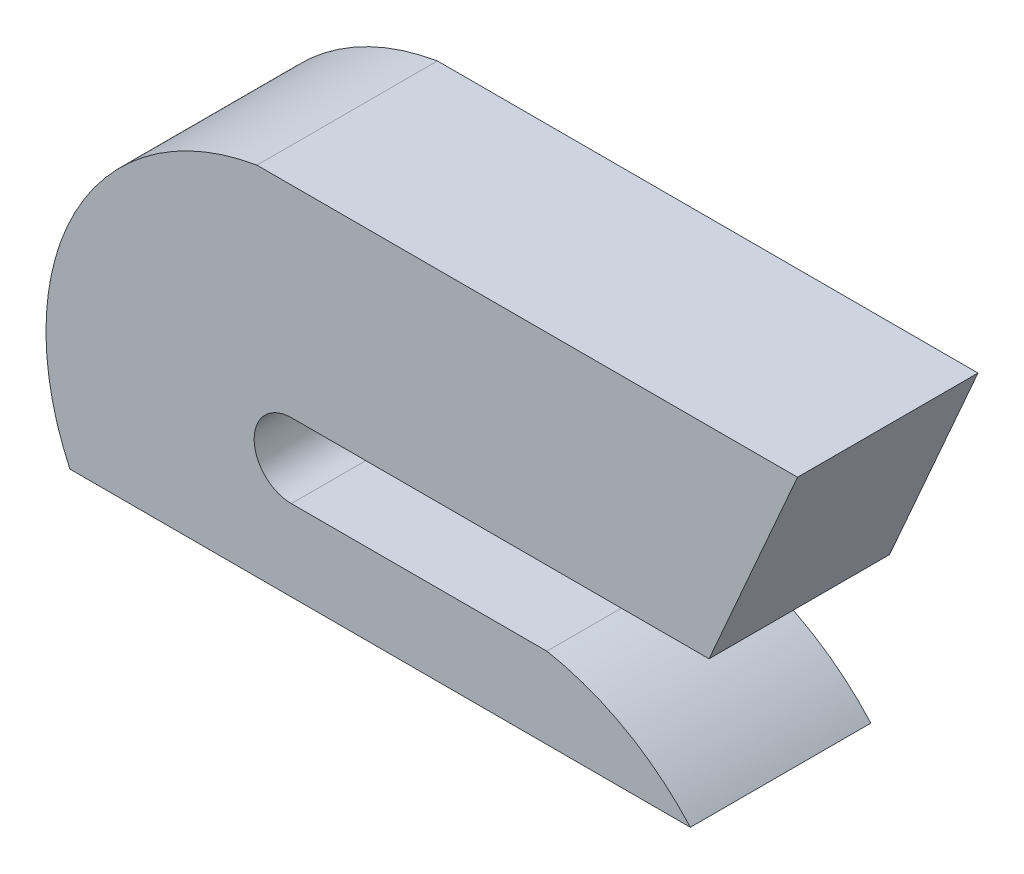
ISO-10303-21;
HEADER;
FILE_DESCRIPTION(('STEP AP214'),'2;1');
FILE_NAME('part.step','',(''),(''),'','','');
FILE_SCHEMA(('AUTOMOTIVE_DESIGN { 1 0 10303 214 1 1 1 1 }'));
ENDSEC;
DATA;
#1=APPLICATION_CONTEXT('core data for automotive mechanical design processes');
#2=APPLICATION_PROTOCOL_DEFINITION('international standard','automotive_design',2000,#1);
#3=PRODUCT_CONTEXT('',#1,'mechanical');
#4=PRODUCT('Part','Part','',(#3));
#5=PRODUCT_RELATED_PRODUCT_CATEGORY('part','',(#4));
#6=PRODUCT_DEFINITION_FORMATION('','',#4);
#7=PRODUCT_DEFINITION_CONTEXT('part definition',#1,'design');
#8=PRODUCT_DEFINITION('design','',#6,#7);
#9=PRODUCT_DEFINITION_SHAPE('','',#8);
#10=(LENGTH_UNIT() NAMED_UNIT(*) SI_UNIT(.MILLI.,.METRE.));
#11=(NAMED_UNIT(*) PLANE_ANGLE_UNIT() SI_UNIT($,.RADIAN.));
#12=(NAMED_UNIT(*) SI_UNIT($,.STERADIAN.) SOLID_ANGLE_UNIT());
#13=UNCERTAINTY_MEASURE_WITH_UNIT(LENGTH_MEASURE(1.E-05),#10,'distance_accuracy_value','');
#14=(GEOMETRIC_REPRESENTATION_CONTEXT(3) GLOBAL_UNCERTAINTY_ASSIGNED_CONTEXT((#13)) GLOBAL_UNIT_ASSIGNED_CONTEXT((#10,
#11,#12)) REPRESENTATION_CONTEXT('',''));
#15=CARTESIAN_POINT('',(0.,0.,0.));
#16=DIRECTION('',(0.,0.,1.));
#17=DIRECTION('',(1.,0.,0.));
#18=AXIS2_PLACEMENT_3D('',#15,#16,#17);
#19=CARTESIAN_POINT('',(-26.756089269406,6.191796411763,0.));
#20=DIRECTION('',(0.915644042336993,-0.401990034369972,0.));
#21=DIRECTION('',(0.401990034369972,0.915644042336993,0.));
#22=AXIS2_PLACEMENT_3D('',#19,#20,#21);
#23=PLANE('',#22);
#24=DIRECTION('',(0.401990034369972,0.915644042336993,0.));
#25=VECTOR('',#24,1.);
#26=CARTESIAN_POINT('',(-26.756089269406,6.191796411763,0.));
#27=LINE('',#26,#25);
#28=CARTESIAN_POINT('',(-26.756089269406,6.191796411763,0.));
#29=VERTEX_POINT('',#28);
#30=CARTESIAN_POINT('',(-26.707083168348,6.30342142889,0.));
#31=VERTEX_POINT('',#30);
#32=EDGE_CURVE('E11',#29,#31,#27,.T.);
#33=ORIENTED_EDGE('',*,*,#32,.T.);
#34=DIRECTION('',(0.,0.,1.));
#35=VECTOR('',#34,1.);
#36=CARTESIAN_POINT('',(-26.707083168348,6.30342142889,0.));
#37=LINE('',#36,#35);
#38=CARTESIAN_POINT('',(-26.707083168348,6.30342142889,0.1));
#39=VERTEX_POINT('',#38);
#40=EDGE_CURVE('E24',#31,#39,#37,.T.);
#41=ORIENTED_EDGE('',*,*,#40,.T.);
#42=DIRECTION('',(0.401990034369972,0.915644042336993,0.));
#43=VECTOR('',#42,1.);
#44=CARTESIAN_POINT('',(-26.756089269406,6.191796411763,0.1));
#45=LINE('',#44,#43);
#46=CARTESIAN_POINT('',(-26.756089269406,6.191796411763,0.1));
#47=VERTEX_POINT('',#46);
#48=EDGE_CURVE('E100',#47,#39,#45,.T.);
#49=ORIENTED_EDGE('',*,*,#48,.F.);
#50=DIRECTION('',(0.,0.,1.));
#51=VECTOR('',#50,1.);
#52=CARTESIAN_POINT('',(-26.756089269406,6.191796411763,0.));
#53=LINE('',#52,#51);
#54=EDGE_CURVE('E145',#29,#47,#53,.T.);
#55=ORIENTED_EDGE('',*,*,#54,.F.);
#56=EDGE_LOOP('',(#33,#41,#49,#55));
#57=FACE_BOUND('',#56,.T.);
#58=ADVANCED_FACE('F17',(#57),#23,.T.);
#59=CARTESIAN_POINT('',(-26.987506968845,6.191796411763,0.));
#60=DIRECTION('',(0.,-1.,0.));
#61=DIRECTION('',(1.,0.,0.));
#62=AXIS2_PLACEMENT_3D('',#59,#60,#61);
#63=PLANE('',#62);
#64=DIRECTION('',(1.,0.,0.));
#65=VECTOR('',#64,1.);
#66=CARTESIAN_POINT('',(-26.987506968845,6.191796411763,0.));
#67=LINE('',#66,#65);
#68=CARTESIAN_POINT('',(-26.987506968845,6.191796411763,0.));
#69=VERTEX_POINT('',#68);
#70=EDGE_CURVE('E142',#69,#29,#67,.T.);
#71=ORIENTED_EDGE('',*,*,#70,.T.);
#72=ORIENTED_EDGE('',*,*,#54,.T.);
#73=DIRECTION('',(1.,0.,0.));
#74=VECTOR('',#73,1.);
#75=CARTESIAN_POINT('',(-26.987506968845,6.191796411763,0.1));
#76=LINE('',#75,#74);
#77=CARTESIAN_POINT('',(-26.987506968845,6.191796411763,0.1));
#78=VERTEX_POINT('',#77);
#79=EDGE_CURVE('E140',#78,#47,#76,.T.);
#80=ORIENTED_EDGE('',*,*,#79,.F.);
#81=DIRECTION('',(0.,0.,1.));
#82=VECTOR('',#81,1.);
#83=CARTESIAN_POINT('',(-26.987506968845,6.191796411763,0.));
#84=LINE('',#83,#82);
#85=EDGE_CURVE('E137',#69,#78,#84,.T.);
#86=ORIENTED_EDGE('',*,*,#85,.F.);
#87=EDGE_LOOP('',(#71,#72,#80,#86));
#88=FACE_BOUND('',#87,.T.);
#89=ADVANCED_FACE('F163',(#88),#63,.T.);
#90=CARTESIAN_POINT('',(-26.987506968845,6.171175993907,0.));
#91=DIRECTION('',(0.,0.,1.));
#92=DIRECTION('',(0.,-1.,0.));
#93=AXIS2_PLACEMENT_3D('',#90,#91,#92);
#94=CYLINDRICAL_SURFACE('',#93,0.0206204178561543);
#95=CARTESIAN_POINT('',(-26.987506968845,6.171175993907,0.));
#96=DIRECTION('',(0.,0.,-1.));
#97=DIRECTION('',(0.,-1.,0.));
#98=AXIS2_PLACEMENT_3D('',#95,#96,#97);
#99=CIRCLE('',#98,0.0206204178561543);
#100=CARTESIAN_POINT('',(-26.987506968845,6.150555576051,0.));
#101=VERTEX_POINT('',#100);
#102=EDGE_CURVE('E134',#101,#69,#99,.T.);
#103=ORIENTED_EDGE('',*,*,#102,.T.);
#104=ORIENTED_EDGE('',*,*,#85,.T.);
#105=CARTESIAN_POINT('',(-26.987506968845,6.171175993907,0.1));
#106=DIRECTION('',(0.,0.,-1.));
#107=DIRECTION('',(0.,-1.,0.));
#108=AXIS2_PLACEMENT_3D('',#105,#106,#107);
#109=CIRCLE('',#108,0.0206204178561543);
#110=CARTESIAN_POINT('',(-26.987506968845,6.150555576051,0.1));
#111=VERTEX_POINT('',#110);
#112=EDGE_CURVE('E131',#111,#78,#109,.T.);
#113=ORIENTED_EDGE('',*,*,#112,.F.);
#114=DIRECTION('',(0.,0.,1.));
#115=VECTOR('',#114,1.);
#116=CARTESIAN_POINT('',(-26.987506968845,6.150555576051,0.));
#117=LINE('',#116,#115);
#118=EDGE_CURVE('E129',#101,#111,#117,.T.);
#119=ORIENTED_EDGE('',*,*,#118,.F.);
#120=EDGE_LOOP('',(#103,#104,#113,#119));
#121=FACE_BOUND('',#120,.T.);
#122=ADVANCED_FACE('F160',(#121),#94,.F.);
#123=CARTESIAN_POINT('',(-26.845933788011,6.150555576051,0.));
#124=DIRECTION('',(0.,1.,0.));
#125=DIRECTION('',(-1.,0.,0.));
#126=AXIS2_PLACEMENT_3D('',#123,#124,#125);
#127=PLANE('',#126);
#128=DIRECTION('',(-1.,0.,0.));
#129=VECTOR('',#128,1.);
#130=CARTESIAN_POINT('',(-26.845933788011,6.150555576051,0.));
#131=LINE('',#130,#129);
#132=CARTESIAN_POINT('',(-26.845933788011,6.150555576051,0.));
#133=VERTEX_POINT('',#132);
#134=EDGE_CURVE('E126',#133,#101,#131,.T.);
#135=ORIENTED_EDGE('',*,*,#134,.T.);
#136=ORIENTED_EDGE('',*,*,#118,.T.);
#137=DIRECTION('',(-1.,0.,0.));
#138=VECTOR('',#137,1.);
#139=CARTESIAN_POINT('',(-26.845933788011,6.150555576051,0.1));
#140=LINE('',#139,#138);
#141=CARTESIAN_POINT('',(-26.845933788011,6.150555576051,0.1));
#142=VERTEX_POINT('',#141);
#143=EDGE_CURVE('E123',#142,#111,#140,.T.);
#144=ORIENTED_EDGE('',*,*,#143,.F.);
#145=DIRECTION('',(0.,0.,1.));
#146=VECTOR('',#145,1.);
#147=CARTESIAN_POINT('',(-26.845933788011,6.150555576051,0.));
#148=LINE('',#147,#146);
#149=EDGE_CURVE('E120',#133,#142,#148,.T.);
#150=ORIENTED_EDGE('',*,*,#149,.F.);
#151=EDGE_LOOP('',(#135,#136,#144,#150));
#152=FACE_BOUND('',#151,.T.);
#153=ADVANCED_FACE('F156',(#152),#127,.T.);
#154=CARTESIAN_POINT('',(-26.871812170946,6.011699918327,0.));
#155=DIRECTION('',(0.,0.,1.));
#156=DIRECTION('',(0.745976305161519,0.665972486021434,0.));
#157=AXIS2_PLACEMENT_3D('',#154,#155,#156);
#158=CYLINDRICAL_SURFACE('',#157,0.14124653760403);
#159=CARTESIAN_POINT('',(-26.871812170946,6.011699918327,0.));
#160=DIRECTION('',(0.,0.,1.));
#161=DIRECTION('',(0.745976305161519,0.665972486021434,0.));
#162=AXIS2_PLACEMENT_3D('',#159,#160,#161);
#163=CIRCLE('',#162,0.14124653760403);
#164=CARTESIAN_POINT('',(-26.766445600707,6.105766226117,0.));
#165=VERTEX_POINT('',#164);
#166=EDGE_CURVE('E117',#165,#133,#163,.T.);
#167=ORIENTED_EDGE('',*,*,#166,.T.);
#168=ORIENTED_EDGE('',*,*,#149,.T.);
#169=CARTESIAN_POINT('',(-26.871812170946,6.011699918327,0.1));
#170=DIRECTION('',(0.,0.,1.));
#171=DIRECTION('',(0.745976305161519,0.665972486021434,0.));
#172=AXIS2_PLACEMENT_3D('',#169,#170,#171);
#173=CIRCLE('',#172,0.14124653760403);
#174=CARTESIAN_POINT('',(-26.766445600707,6.105766226117,0.1));
#175=VERTEX_POINT('',#174);
#176=EDGE_CURVE('E114',#175,#142,#173,.T.);
#177=ORIENTED_EDGE('',*,*,#176,.F.);
#178=DIRECTION('',(0.,0.,1.));
#179=VECTOR('',#178,1.);
#180=CARTESIAN_POINT('',(-26.766445600707,6.105766226117,0.));
#181=LINE('',#180,#179);
#182=EDGE_CURVE('E111',#165,#175,#181,.T.);
#183=ORIENTED_EDGE('',*,*,#182,.F.);
#184=EDGE_LOOP('',(#167,#168,#177,#183));
#185=FACE_BOUND('',#184,.T.);
#186=ADVANCED_FACE('F153',(#185),#158,.T.);
#187=CARTESIAN_POINT('',(-27.110195366146,6.105766226117,0.));
#188=DIRECTION('',(0.,-1.,0.));
#189=DIRECTION('',(1.,0.,0.));
#190=AXIS2_PLACEMENT_3D('',#187,#188,#189);
#191=PLANE('',#190);
#192=DIRECTION('',(1.,0.,0.));
#193=VECTOR('',#192,1.);
#194=CARTESIAN_POINT('',(-27.110195366146,6.105766226117,0.));
#195=LINE('',#194,#193);
#196=CARTESIAN_POINT('',(-27.110195366146,6.105766226117,0.));
#197=VERTEX_POINT('',#196);
#198=EDGE_CURVE('E108',#197,#165,#195,.T.);
#199=ORIENTED_EDGE('',*,*,#198,.T.);
#200=ORIENTED_EDGE('',*,*,#182,.T.);
#201=DIRECTION('',(1.,0.,0.));
#202=VECTOR('',#201,1.);
#203=CARTESIAN_POINT('',(-27.110195366146,6.105766226117,0.1));
#204=LINE('',#203,#202);
#205=CARTESIAN_POINT('',(-27.110195366146,6.105766226117,0.1));
#206=VERTEX_POINT('',#205);
#207=EDGE_CURVE('E106',#206,#175,#204,.T.);
#208=ORIENTED_EDGE('',*,*,#207,.F.);
#209=DIRECTION('',(0.,0.,1.));
#210=VECTOR('',#209,1.);
#211=CARTESIAN_POINT('',(-27.110195366146,6.105766226117,0.));
#212=LINE('',#211,#210);
#213=EDGE_CURVE('E85',#197,#206,#212,.T.);
#214=ORIENTED_EDGE('',*,*,#213,.F.);
#215=EDGE_LOOP('',(#199,#200,#208,#214));
#216=FACE_BOUND('',#215,.T.);
#217=ADVANCED_FACE('F151',(#216),#191,.T.);
#218=CARTESIAN_POINT('',(-26.983342085285,6.165251438178,0.));
#219=DIRECTION('',(0.,0.,1.));
#220=DIRECTION('',(-0.165749389770488,0.98616790648992,0.));
#221=AXIS2_PLACEMENT_3D('',#218,#219,#220);
#222=CYLINDRICAL_SURFACE('',#221,0.140107977356891);
#223=CARTESIAN_POINT('',(-26.983342085285,6.165251438178,0.));
#224=DIRECTION('',(0.,0.,1.));
#225=DIRECTION('',(-0.165749389770488,0.98616790648992,0.));
#226=AXIS2_PLACEMENT_3D('',#223,#224,#225);
#227=CIRCLE('',#226,0.140107977356891);
#228=CARTESIAN_POINT('',(-27.006564897034,6.30342142889,0.));
#229=VERTEX_POINT('',#228);
#230=EDGE_CURVE('E89',#229,#197,#227,.T.);
#231=ORIENTED_EDGE('',*,*,#230,.T.);
#232=ORIENTED_EDGE('',*,*,#213,.T.);
#233=CARTESIAN_POINT('',(-26.983342085285,6.165251438178,0.1));
#234=DIRECTION('',(0.,0.,1.));
#235=DIRECTION('',(-0.165749389770488,0.98616790648992,0.));
#236=AXIS2_PLACEMENT_3D('',#233,#234,#235);
#237=CIRCLE('',#236,0.140107977356891);
#238=CARTESIAN_POINT('',(-27.006564897034,6.30342142889,0.1));
#239=VERTEX_POINT('',#238);
#240=EDGE_CURVE('E78',#239,#206,#237,.T.);
#241=ORIENTED_EDGE('',*,*,#240,.F.);
#242=DIRECTION('',(0.,0.,1.));
#243=VECTOR('',#242,1.);
#244=CARTESIAN_POINT('',(-27.006564897034,6.30342142889,0.));
#245=LINE('',#244,#243);
#246=EDGE_CURVE('E82',#229,#239,#245,.T.);
#247=ORIENTED_EDGE('',*,*,#246,.F.);
#248=EDGE_LOOP('',(#231,#232,#241,#247));
#249=FACE_BOUND('',#248,.T.);
#250=ADVANCED_FACE('F81',(#249),#222,.T.);
#251=CARTESIAN_POINT('',(-26.707083168348,6.30342142889,0.));
#252=DIRECTION('',(0.,1.,0.));
#253=DIRECTION('',(-1.,0.,0.));
#254=AXIS2_PLACEMENT_3D('',#251,#252,#253);
#255=PLANE('',#254);
#256=DIRECTION('',(-1.,0.,0.));
#257=VECTOR('',#256,1.);
#258=CARTESIAN_POINT('',(-26.707083168348,6.30342142889,0.));
#259=LINE('',#258,#257);
#260=EDGE_CURVE('E95',#31,#229,#259,.T.);
#261=ORIENTED_EDGE('',*,*,#260,.T.);
#262=ORIENTED_EDGE('',*,*,#246,.T.);
#263=DIRECTION('',(-1.,0.,0.));
#264=VECTOR('',#263,1.);
#265=CARTESIAN_POINT('',(-26.707083168348,6.30342142889,0.1));
#266=LINE('',#265,#264);
#267=EDGE_CURVE('E94',#39,#239,#266,.T.);
#268=ORIENTED_EDGE('',*,*,#267,.F.);
#269=ORIENTED_EDGE('',*,*,#40,.F.);
#270=EDGE_LOOP('',(#261,#262,#268,#269));
#271=FACE_BOUND('',#270,.T.);
#272=ADVANCED_FACE('F93',(#271),#255,.T.);
#273=CARTESIAN_POINT('',(-26.907338186841,6.195549159886,0.1));
#274=DIRECTION('',(0.,0.,1.));
#275=DIRECTION('',(1.,0.,0.));
#276=AXIS2_PLACEMENT_3D('',#273,#274,#275);
#277=PLANE('',#276);
#278=ORIENTED_EDGE('',*,*,#267,.T.);
#279=ORIENTED_EDGE('',*,*,#240,.T.);
#280=ORIENTED_EDGE('',*,*,#207,.T.);
#281=ORIENTED_EDGE('',*,*,#176,.T.);
#282=ORIENTED_EDGE('',*,*,#143,.T.);
#283=ORIENTED_EDGE('',*,*,#112,.T.);
#284=ORIENTED_EDGE('',*,*,#79,.T.);
#285=ORIENTED_EDGE('',*,*,#48,.T.);
#286=EDGE_LOOP('',(#278,#279,#280,#281,#282,#283,#284,#285));
#287=FACE_BOUND('',#286,.T.);
#288=ADVANCED_FACE('F98',(#287),#277,.T.);
#289=CARTESIAN_POINT('',(-26.907338186841,6.195549159886,0.));
#290=DIRECTION('',(0.,0.,1.));
#291=DIRECTION('',(1.,0.,0.));
#292=AXIS2_PLACEMENT_3D('',#289,#290,#291);
#293=PLANE('',#292);
#294=ORIENTED_EDGE('',*,*,#260,.F.);
#295=ORIENTED_EDGE('',*,*,#32,.F.);
#296=ORIENTED_EDGE('',*,*,#70,.F.);
#297=ORIENTED_EDGE('',*,*,#102,.F.);
#298=ORIENTED_EDGE('',*,*,#134,.F.);
#299=ORIENTED_EDGE('',*,*,#166,.F.);
#300=ORIENTED_EDGE('',*,*,#198,.F.);
#301=ORIENTED_EDGE('',*,*,#230,.F.);
#302=EDGE_LOOP('',(#294,#295,#296,#297,#298,#299,#300,#301));
#303=FACE_BOUND('',#302,.T.);
#304=ADVANCED_FACE('F148',(#303),#293,.F.);
#305=CLOSED_SHELL('',(#58,#89,#122,#153,#186,#217,#250,#272,#288,#304));
#306=MANIFOLD_SOLID_BREP('B1',#305);
#307=ADVANCED_BREP_SHAPE_REPRESENTATION('',(#18,#306),#14);
#308=SHAPE_DEFINITION_REPRESENTATION(#9,#307);
ENDSEC;
END-ISO-10303-21;
